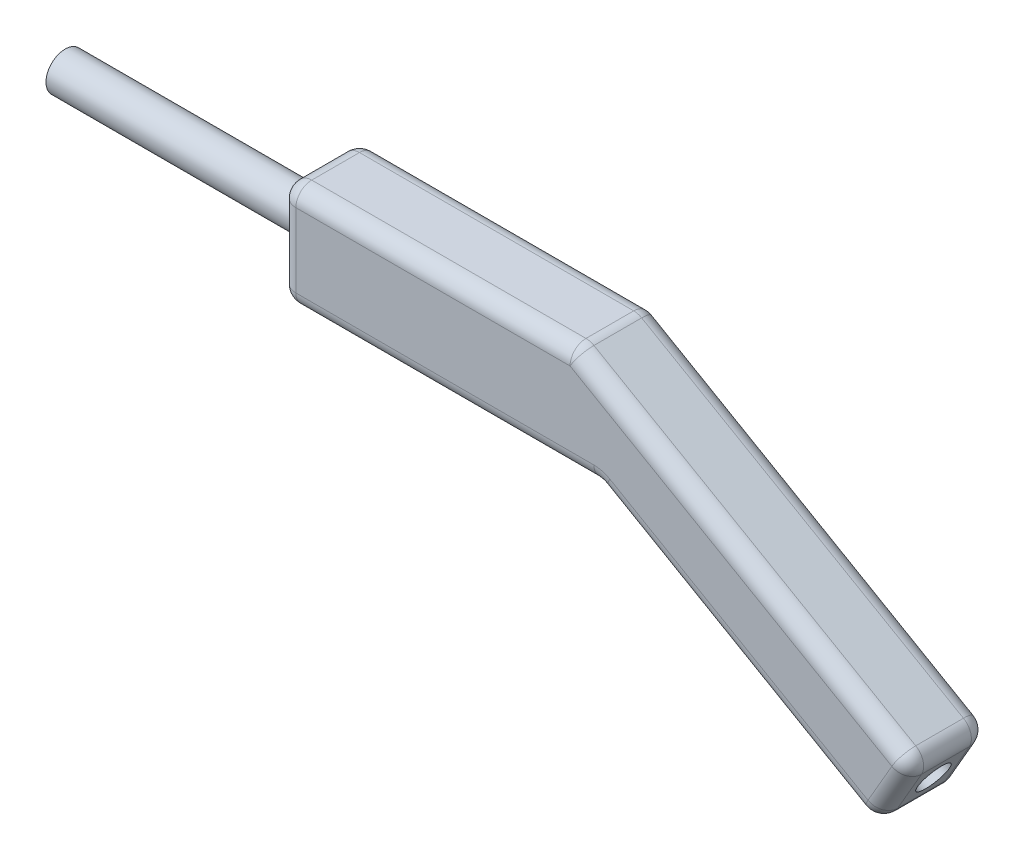
ISO-10303-21;
HEADER;
FILE_DESCRIPTION(('STEP AP214'),'2;1');
FILE_NAME('part.step','',(''),(''),'','','');
FILE_SCHEMA(('AUTOMOTIVE_DESIGN { 1 0 10303 214 1 1 1 1 }'));
ENDSEC;
DATA;
#1=APPLICATION_CONTEXT('core data for automotive mechanical design processes');
#2=APPLICATION_PROTOCOL_DEFINITION('international standard','automotive_design',2000,#1);
#3=PRODUCT_CONTEXT('',#1,'mechanical');
#4=PRODUCT('Part','Part','',(#3));
#5=PRODUCT_RELATED_PRODUCT_CATEGORY('part','',(#4));
#6=PRODUCT_DEFINITION_FORMATION('','',#4);
#7=PRODUCT_DEFINITION_CONTEXT('part definition',#1,'design');
#8=PRODUCT_DEFINITION('design','',#6,#7);
#9=PRODUCT_DEFINITION_SHAPE('','',#8);
#10=(LENGTH_UNIT() NAMED_UNIT(*) SI_UNIT(.MILLI.,.METRE.));
#11=(NAMED_UNIT(*) PLANE_ANGLE_UNIT() SI_UNIT($,.RADIAN.));
#12=(NAMED_UNIT(*) SI_UNIT($,.STERADIAN.) SOLID_ANGLE_UNIT());
#13=UNCERTAINTY_MEASURE_WITH_UNIT(LENGTH_MEASURE(1.E-05),#10,'distance_accuracy_value','');
#14=(GEOMETRIC_REPRESENTATION_CONTEXT(3) GLOBAL_UNCERTAINTY_ASSIGNED_CONTEXT((#13)) GLOBAL_UNIT_ASSIGNED_CONTEXT((#10,
#11,#12)) REPRESENTATION_CONTEXT('',''));
#15=CARTESIAN_POINT('',(0.,0.,0.));
#16=DIRECTION('',(0.,0.,1.));
#17=DIRECTION('',(1.,0.,0.));
#18=AXIS2_PLACEMENT_3D('',#15,#16,#17);
#19=CARTESIAN_POINT('',(2.06544742485837,-1.78301475115433,2.5));
#20=DIRECTION('',(0.499999999999998,0.86602540378444,0.));
#21=DIRECTION('',(-0.86602540378444,0.499999999999998,0.));
#22=AXIS2_PLACEMENT_3D('',#19,#20,#21);
#23=PLANE('',#22);
#24=DIRECTION('',(0.,0.,-1.));
#25=VECTOR('',#24,1.);
#26=CARTESIAN_POINT('',(2.18147282864281,-1.85000204926211,0.));
#27=LINE('',#26,#25);
#28=CARTESIAN_POINT('',(2.18147282864281,-1.85000204926211,2.));
#29=VERTEX_POINT('',#28);
#30=CARTESIAN_POINT('',(2.18147282864281,-1.85000204926211,0.5));
#31=VERTEX_POINT('',#30);
#32=EDGE_CURVE('E326',#29,#31,#27,.T.);
#33=ORIENTED_EDGE('',*,*,#32,.T.);
#34=DIRECTION('',(0.86602540378444,-0.499999999999998,0.));
#35=VECTOR('',#34,1.);
#36=CARTESIAN_POINT('',(2.06544742485837,-1.78301475115433,0.5));
#37=LINE('',#36,#35);
#38=CARTESIAN_POINT('',(10.2926887608106,-6.53301475115431,0.5));
#39=VERTEX_POINT('',#38);
#40=EDGE_CURVE('E329',#31,#39,#37,.T.);
#41=ORIENTED_EDGE('',*,*,#40,.T.);
#42=DIRECTION('',(0.,0.,-1.));
#43=VECTOR('',#42,1.);
#44=CARTESIAN_POINT('',(10.2926887608106,-6.53301475115431,2.5));
#45=LINE('',#44,#43);
#46=CARTESIAN_POINT('',(10.2926887608106,-6.53301475115431,2.));
#47=VERTEX_POINT('',#46);
#48=EDGE_CURVE('E324',#39,#47,#45,.F.);
#49=ORIENTED_EDGE('',*,*,#48,.T.);
#50=DIRECTION('',(0.86602540378444,-0.499999999999998,0.));
#51=VECTOR('',#50,1.);
#52=CARTESIAN_POINT('',(2.06544742485837,-1.78301475115433,2.));
#53=LINE('',#52,#51);
#54=EDGE_CURVE('E322',#47,#29,#53,.F.);
#55=ORIENTED_EDGE('',*,*,#54,.T.);
#56=EDGE_LOOP('',(#33,#41,#49,#55));
#57=FACE_BOUND('',#56,.T.);
#58=ADVANCED_FACE('F37',(#57),#23,.F.);
#59=CARTESIAN_POINT('',(10.7257014627028,-6.78301475115431,2.5));
#60=DIRECTION('',(-0.866025403784439,0.5,0.));
#61=DIRECTION('',(-0.5,-0.866025403784439,0.));
#62=AXIS2_PLACEMENT_3D('',#59,#60,#61);
#63=PLANE('',#62);
#64=DIRECTION('',(0.,0.,-1.));
#65=VECTOR('',#64,1.);
#66=CARTESIAN_POINT('',(10.9757014627028,-6.35000204926209,2.5));
#67=LINE('',#66,#65);
#68=CARTESIAN_POINT('',(10.9757014627028,-6.35000204926209,2.));
#69=VERTEX_POINT('',#68);
#70=CARTESIAN_POINT('',(10.9757014627028,-6.35000204926209,0.5));
#71=VERTEX_POINT('',#70);
#72=EDGE_CURVE('E182',#69,#71,#67,.T.);
#73=ORIENTED_EDGE('',*,*,#72,.T.);
#74=DIRECTION('',(0.5,0.866025403784439,0.));
#75=VECTOR('',#74,1.);
#76=CARTESIAN_POINT('',(10.7257014627028,-6.78301475115431,0.5));
#77=LINE('',#76,#75);
#78=CARTESIAN_POINT('',(11.7257014627028,-5.05096394358546,0.5));
#79=VERTEX_POINT('',#78);
#80=EDGE_CURVE('E178',#71,#79,#77,.T.);
#81=ORIENTED_EDGE('',*,*,#80,.T.);
#82=DIRECTION('',(0.,0.,-1.));
#83=VECTOR('',#82,1.);
#84=CARTESIAN_POINT('',(11.7257014627028,-5.05096394358546,2.5));
#85=LINE('',#84,#83);
#86=CARTESIAN_POINT('',(11.7257014627028,-5.05096394358546,2.));
#87=VERTEX_POINT('',#86);
#88=EDGE_CURVE('E171',#79,#87,#85,.F.);
#89=ORIENTED_EDGE('',*,*,#88,.T.);
#90=DIRECTION('',(0.5,0.866025403784439,0.));
#91=VECTOR('',#90,1.);
#92=CARTESIAN_POINT('',(10.7257014627028,-6.78301475115431,2.));
#93=LINE('',#92,#91);
#94=EDGE_CURVE('E175',#87,#69,#93,.F.);
#95=ORIENTED_EDGE('',*,*,#94,.T.);
#96=EDGE_LOOP('',(#73,#81,#89,#95));
#97=FACE_BOUND('',#96,.T.);
#98=CARTESIAN_POINT('',(11.3507014627028,-5.70048299642376,1.25));
#99=DIRECTION('',(0.866025403784439,-0.5,0.));
#100=DIRECTION('',(0.5,0.866025403784439,0.));
#101=AXIS2_PLACEMENT_3D('',#98,#99,#100);
#102=CIRCLE('',#101,0.5);
#103=CARTESIAN_POINT('',(11.6007014627028,-5.26747029453154,1.25));
#104=VERTEX_POINT('',#103);
#105=EDGE_CURVE('E292',#104,#104,#102,.T.);
#106=ORIENTED_EDGE('',*,*,#105,.F.);
#107=EDGE_LOOP('',(#106));
#108=FACE_BOUND('',#107,.T.);
#109=ADVANCED_FACE('F173',(#97,#108),#63,.F.);
#110=CARTESIAN_POINT('',(1.31544742485839,1.53674929668601,2.5));
#111=DIRECTION('',(-0.5,-0.866025403784439,0.));
#112=DIRECTION('',(0.866025403784439,-0.5,0.));
#113=AXIS2_PLACEMENT_3D('',#110,#111,#112);
#114=PLANE('',#113);
#115=DIRECTION('',(-0.866025403784439,0.5,0.));
#116=VECTOR('',#115,1.);
#117=CARTESIAN_POINT('',(11.9757014627028,-4.61795124169324,2.));
#118=LINE('',#117,#116);
#119=CARTESIAN_POINT('',(1.43147282864283,1.46976199857822,2.));
#120=VERTEX_POINT('',#119);
#121=CARTESIAN_POINT('',(11.5426887608105,-4.36795124169324,2.));
#122=VERTEX_POINT('',#121);
#123=EDGE_CURVE('E342',#120,#122,#118,.F.);
#124=ORIENTED_EDGE('',*,*,#123,.T.);
#125=DIRECTION('',(0.,0.,-1.));
#126=VECTOR('',#125,1.);
#127=CARTESIAN_POINT('',(11.5426887608105,-4.36795124169324,2.5));
#128=LINE('',#127,#126);
#129=CARTESIAN_POINT('',(11.5426887608105,-4.36795124169324,0.5));
#130=VERTEX_POINT('',#129);
#131=EDGE_CURVE('E206',#122,#130,#128,.T.);
#132=ORIENTED_EDGE('',*,*,#131,.T.);
#133=DIRECTION('',(-0.866025403784439,0.5,0.));
#134=VECTOR('',#133,1.);
#135=CARTESIAN_POINT('',(1.31544742485839,1.53674929668601,0.5));
#136=LINE('',#135,#134);
#137=CARTESIAN_POINT('',(1.43147282864283,1.46976199857822,0.5));
#138=VERTEX_POINT('',#137);
#139=EDGE_CURVE('E344',#130,#138,#136,.T.);
#140=ORIENTED_EDGE('',*,*,#139,.T.);
#141=DIRECTION('',(0.,0.,-1.));
#142=VECTOR('',#141,1.);
#143=CARTESIAN_POINT('',(1.43147282864283,1.46976199857822,2.5));
#144=LINE('',#143,#142);
#145=EDGE_CURVE('E340',#138,#120,#144,.F.);
#146=ORIENTED_EDGE('',*,*,#145,.T.);
#147=EDGE_LOOP('',(#124,#132,#140,#146));
#148=FACE_BOUND('',#147,.T.);
#149=ADVANCED_FACE('F414',(#148),#114,.F.);
#150=CARTESIAN_POINT('',(-7.93455257514163,1.53674929668601,2.5));
#151=DIRECTION('',(0.,-1.,0.));
#152=DIRECTION('',(0.,0.,-1.));
#153=AXIS2_PLACEMENT_3D('',#150,#151,#152);
#154=PLANE('',#153);
#155=DIRECTION('',(-1.,0.,0.));
#156=VECTOR('',#155,1.);
#157=CARTESIAN_POINT('',(1.31544742485839,1.53674929668601,2.));
#158=LINE('',#157,#156);
#159=CARTESIAN_POINT('',(-7.43455257514163,1.53674929668601,2.));
#160=VERTEX_POINT('',#159);
#161=CARTESIAN_POINT('',(1.18147282864283,1.53674929668601,2.));
#162=VERTEX_POINT('',#161);
#163=EDGE_CURVE('E367',#160,#162,#158,.F.);
#164=ORIENTED_EDGE('',*,*,#163,.T.);
#165=DIRECTION('',(0.,0.,-1.));
#166=VECTOR('',#165,1.);
#167=CARTESIAN_POINT('',(1.18147282864283,1.53674929668601,2.5));
#168=LINE('',#167,#166);
#169=CARTESIAN_POINT('',(1.18147282864283,1.53674929668601,0.5));
#170=VERTEX_POINT('',#169);
#171=EDGE_CURVE('E369',#162,#170,#168,.T.);
#172=ORIENTED_EDGE('',*,*,#171,.T.);
#173=DIRECTION('',(-1.,0.,0.));
#174=VECTOR('',#173,1.);
#175=CARTESIAN_POINT('',(-7.93455257514163,1.53674929668601,0.5));
#176=LINE('',#175,#174);
#177=CARTESIAN_POINT('',(-7.43455257514163,1.53674929668601,0.5));
#178=VERTEX_POINT('',#177);
#179=EDGE_CURVE('E365',#170,#178,#176,.T.);
#180=ORIENTED_EDGE('',*,*,#179,.T.);
#181=DIRECTION('',(0.,0.,-1.));
#182=VECTOR('',#181,1.);
#183=CARTESIAN_POINT('',(-7.43455257514163,1.53674929668601,2.5));
#184=LINE('',#183,#182);
#185=EDGE_CURVE('E363',#178,#160,#184,.F.);
#186=ORIENTED_EDGE('',*,*,#185,.T.);
#187=EDGE_LOOP('',(#164,#172,#180,#186));
#188=FACE_BOUND('',#187,.T.);
#189=ADVANCED_FACE('F531',(#188),#154,.F.);
#190=CARTESIAN_POINT('',(-7.93455257514163,1.53674929668601,2.5));
#191=DIRECTION('',(1.,0.,0.));
#192=DIRECTION('',(0.,0.,-1.));
#193=AXIS2_PLACEMENT_3D('',#190,#191,#192);
#194=PLANE('',#193);
#195=DIRECTION('',(0.,0.,-1.));
#196=VECTOR('',#195,1.);
#197=CARTESIAN_POINT('',(-7.93455257514163,1.03674929668601,2.5));
#198=LINE('',#197,#196);
#199=CARTESIAN_POINT('',(-7.93455257514163,1.03674929668601,2.));
#200=VERTEX_POINT('',#199);
#201=CARTESIAN_POINT('',(-7.93455257514163,1.03674929668601,0.5));
#202=VERTEX_POINT('',#201);
#203=EDGE_CURVE('E372',#200,#202,#198,.T.);
#204=ORIENTED_EDGE('',*,*,#203,.T.);
#205=DIRECTION('',(0.,-1.,0.));
#206=VECTOR('',#205,1.);
#207=CARTESIAN_POINT('',(-7.93455257514163,1.53674929668601,0.5));
#208=LINE('',#207,#206);
#209=CARTESIAN_POINT('',(-7.93455257514163,-1.28301475115433,0.5));
#210=VERTEX_POINT('',#209);
#211=EDGE_CURVE('E11',#202,#210,#208,.T.);
#212=ORIENTED_EDGE('',*,*,#211,.T.);
#213=DIRECTION('',(0.,0.,-1.));
#214=VECTOR('',#213,1.);
#215=CARTESIAN_POINT('',(-7.93455257514163,-1.28301475115433,2.5));
#216=LINE('',#215,#214);
#217=CARTESIAN_POINT('',(-7.93455257514163,-1.28301475115433,2.));
#218=VERTEX_POINT('',#217);
#219=EDGE_CURVE('E46',#210,#218,#216,.F.);
#220=ORIENTED_EDGE('',*,*,#219,.T.);
#221=DIRECTION('',(0.,-1.,0.));
#222=VECTOR('',#221,1.);
#223=CARTESIAN_POINT('',(-7.93455257514163,1.53674929668601,2.));
#224=LINE('',#223,#222);
#225=EDGE_CURVE('E374',#218,#200,#224,.F.);
#226=ORIENTED_EDGE('',*,*,#225,.T.);
#227=EDGE_LOOP('',(#204,#212,#220,#226));
#228=FACE_BOUND('',#227,.T.);
#229=CARTESIAN_POINT('',(-7.93455257514163,-0.123132727234164,1.25));
#230=DIRECTION('',(-1.,0.,0.));
#231=DIRECTION('',(0.,0.,1.));
#232=AXIS2_PLACEMENT_3D('',#229,#230,#231);
#233=CIRCLE('',#232,0.6);
#234=CARTESIAN_POINT('',(-7.93455257514163,-0.123132727234164,1.85));
#235=VERTEX_POINT('',#234);
#236=EDGE_CURVE('E194',#235,#235,#233,.T.);
#237=ORIENTED_EDGE('',*,*,#236,.F.);
#238=EDGE_LOOP('',(#237));
#239=FACE_BOUND('',#238,.T.);
#240=ADVANCED_FACE('F549',(#228,#239),#194,.F.);
#241=CARTESIAN_POINT('',(-7.93455257514163,-1.78301475115433,2.5));
#242=DIRECTION('',(0.,1.,0.));
#243=DIRECTION('',(-1.,0.,0.));
#244=AXIS2_PLACEMENT_3D('',#241,#242,#243);
#245=PLANE('',#244);
#246=DIRECTION('',(1.,0.,0.));
#247=VECTOR('',#246,1.);
#248=CARTESIAN_POINT('',(-7.93455257514163,-1.78301475115433,0.5));
#249=LINE('',#248,#247);
#250=CARTESIAN_POINT('',(-7.43455257514163,-1.78301475115433,0.5));
#251=VERTEX_POINT('',#250);
#252=CARTESIAN_POINT('',(1.93147282864281,-1.78301475115433,0.5));
#253=VERTEX_POINT('',#252);
#254=EDGE_CURVE('E333',#251,#253,#249,.T.);
#255=ORIENTED_EDGE('',*,*,#254,.T.);
#256=DIRECTION('',(0.,0.,-1.));
#257=VECTOR('',#256,1.);
#258=CARTESIAN_POINT('',(1.93147282864281,-1.78301475115433,2.5));
#259=LINE('',#258,#257);
#260=CARTESIAN_POINT('',(1.93147282864281,-1.78301475115433,2.));
#261=VERTEX_POINT('',#260);
#262=EDGE_CURVE('E337',#253,#261,#259,.F.);
#263=ORIENTED_EDGE('',*,*,#262,.T.);
#264=DIRECTION('',(1.,0.,0.));
#265=VECTOR('',#264,1.);
#266=CARTESIAN_POINT('',(-7.93455257514163,-1.78301475115433,2.));
#267=LINE('',#266,#265);
#268=CARTESIAN_POINT('',(-7.43455257514163,-1.78301475115433,2.));
#269=VERTEX_POINT('',#268);
#270=EDGE_CURVE('E335',#261,#269,#267,.F.);
#271=ORIENTED_EDGE('',*,*,#270,.T.);
#272=DIRECTION('',(0.,0.,-1.));
#273=VECTOR('',#272,1.);
#274=CARTESIAN_POINT('',(-7.43455257514163,-1.78301475115433,2.5));
#275=LINE('',#274,#273);
#276=EDGE_CURVE('E331',#269,#251,#275,.T.);
#277=ORIENTED_EDGE('',*,*,#276,.T.);
#278=EDGE_LOOP('',(#255,#263,#271,#277));
#279=FACE_BOUND('',#278,.T.);
#280=ADVANCED_FACE('F546',(#279),#245,.F.);
#281=CARTESIAN_POINT('',(0.,0.,2.5));
#282=DIRECTION('',(0.,0.,1.));
#283=DIRECTION('',(1.,0.,0.));
#284=AXIS2_PLACEMENT_3D('',#281,#282,#283);
#285=PLANE('',#284);
#286=CARTESIAN_POINT('',(1.93147282864281,-2.28301475115433,2.5));
#287=DIRECTION('',(0.,0.,1.));
#288=DIRECTION('',(1.,0.,0.));
#289=AXIS2_PLACEMENT_3D('',#286,#287,#288);
#290=CIRCLE('',#289,1.);
#291=CARTESIAN_POINT('',(2.43147282864281,-1.41698934736989,2.5));
#292=VERTEX_POINT('',#291);
#293=CARTESIAN_POINT('',(1.93147282864281,-1.28301475115433,2.5));
#294=VERTEX_POINT('',#293);
#295=EDGE_CURVE('E358',#292,#294,#290,.T.);
#296=ORIENTED_EDGE('',*,*,#295,.F.);
#297=DIRECTION('',(0.86602540378444,-0.499999999999998,0.));
#298=VECTOR('',#297,1.);
#299=CARTESIAN_POINT('',(10.9757014627028,-6.35000204926209,2.5));
#300=LINE('',#299,#298);
#301=CARTESIAN_POINT('',(10.5426887608106,-6.10000204926209,2.5));
#302=VERTEX_POINT('',#301);
#303=EDGE_CURVE('E361',#292,#302,#300,.T.);
#304=ORIENTED_EDGE('',*,*,#303,.T.);
#305=DIRECTION('',(0.5,0.866025403784439,0.));
#306=VECTOR('',#305,1.);
#307=CARTESIAN_POINT('',(11.5426887608105,-4.36795124169324,2.5));
#308=LINE('',#307,#306);
#309=CARTESIAN_POINT('',(11.2926887608105,-4.80096394358546,2.5));
#310=VERTEX_POINT('',#309);
#311=EDGE_CURVE('E355',#302,#310,#308,.T.);
#312=ORIENTED_EDGE('',*,*,#311,.T.);
#313=DIRECTION('',(-0.866025403784439,0.5,0.));
#314=VECTOR('',#313,1.);
#315=CARTESIAN_POINT('',(1.06544742485839,1.10373659479379,2.5));
#316=LINE('',#315,#314);
#317=CARTESIAN_POINT('',(1.18147282864283,1.03674929668601,2.5));
#318=VERTEX_POINT('',#317);
#319=EDGE_CURVE('E353',#310,#318,#316,.T.);
#320=ORIENTED_EDGE('',*,*,#319,.T.);
#321=DIRECTION('',(-1.,0.,0.));
#322=VECTOR('',#321,1.);
#323=CARTESIAN_POINT('',(-7.93455257514163,1.03674929668601,2.5));
#324=LINE('',#323,#322);
#325=CARTESIAN_POINT('',(-7.43455257514163,1.03674929668601,2.5));
#326=VERTEX_POINT('',#325);
#327=EDGE_CURVE('E349',#318,#326,#324,.T.);
#328=ORIENTED_EDGE('',*,*,#327,.T.);
#329=DIRECTION('',(0.,-1.,0.));
#330=VECTOR('',#329,1.);
#331=CARTESIAN_POINT('',(-7.43455257514163,-1.78301475115433,2.5));
#332=LINE('',#331,#330);
#333=CARTESIAN_POINT('',(-7.43455257514163,-1.28301475115433,2.5));
#334=VERTEX_POINT('',#333);
#335=EDGE_CURVE('E347',#326,#334,#332,.T.);
#336=ORIENTED_EDGE('',*,*,#335,.T.);
#337=DIRECTION('',(1.,0.,0.));
#338=VECTOR('',#337,1.);
#339=CARTESIAN_POINT('',(2.06544742485837,-1.28301475115433,2.5));
#340=LINE('',#339,#338);
#341=EDGE_CURVE('E351',#334,#294,#340,.T.);
#342=ORIENTED_EDGE('',*,*,#341,.T.);
#343=EDGE_LOOP('',(#296,#304,#312,#320,#328,#336,#342));
#344=FACE_BOUND('',#343,.T.);
#345=ADVANCED_FACE('F421',(#344),#285,.T.);
#346=CARTESIAN_POINT('',(0.,0.,0.));
#347=DIRECTION('',(0.,0.,1.));
#348=DIRECTION('',(1.,0.,0.));
#349=AXIS2_PLACEMENT_3D('',#346,#347,#348);
#350=PLANE('',#349);
#351=DIRECTION('',(-0.866025403784439,0.5,0.));
#352=VECTOR('',#351,1.);
#353=CARTESIAN_POINT('',(0.744293821303572,1.28915471425738,0.));
#354=LINE('',#353,#352);
#355=CARTESIAN_POINT('',(1.18147282864283,1.03674929668601,0.));
#356=VERTEX_POINT('',#355);
#357=CARTESIAN_POINT('',(11.2926887608105,-4.80096394358546,0.));
#358=VERTEX_POINT('',#357);
#359=EDGE_CURVE('E312',#356,#358,#354,.F.);
#360=ORIENTED_EDGE('',*,*,#359,.T.);
#361=DIRECTION('',(0.5,0.866025403784439,0.));
#362=VECTOR('',#361,1.);
#363=CARTESIAN_POINT('',(10.548394939507,-6.09011865784283,0.));
#364=LINE('',#363,#362);
#365=CARTESIAN_POINT('',(10.5426887608106,-6.10000204926209,0.));
#366=VERTEX_POINT('',#365);
#367=EDGE_CURVE('E319',#358,#366,#364,.F.);
#368=ORIENTED_EDGE('',*,*,#367,.T.);
#369=DIRECTION('',(0.86602540378444,-0.499999999999998,0.));
#370=VECTOR('',#369,1.);
#371=CARTESIAN_POINT('',(-0.0057061786964315,-0.00988339141928657,0.));
#372=LINE('',#371,#370);
#373=CARTESIAN_POINT('',(2.43147282864281,-1.41698934736989,0.));
#374=VERTEX_POINT('',#373);
#375=EDGE_CURVE('E317',#366,#374,#372,.F.);
#376=ORIENTED_EDGE('',*,*,#375,.T.);
#377=CARTESIAN_POINT('',(1.93147282864281,-2.28301475115433,0.));
#378=DIRECTION('',(0.,0.,1.));
#379=DIRECTION('',(1.,0.,0.));
#380=AXIS2_PLACEMENT_3D('',#377,#378,#379);
#381=CIRCLE('',#380,1.);
#382=CARTESIAN_POINT('',(1.93147282864281,-1.28301475115433,0.));
#383=VERTEX_POINT('',#382);
#384=EDGE_CURVE('E314',#383,#374,#381,.F.);
#385=ORIENTED_EDGE('',*,*,#384,.F.);
#386=DIRECTION('',(1.,0.,0.));
#387=VECTOR('',#386,1.);
#388=CARTESIAN_POINT('',(0.,-1.28301475115433,0.));
#389=LINE('',#388,#387);
#390=CARTESIAN_POINT('',(-7.43455257514163,-1.28301475115433,0.));
#391=VERTEX_POINT('',#390);
#392=EDGE_CURVE('E310',#383,#391,#389,.F.);
#393=ORIENTED_EDGE('',*,*,#392,.T.);
#394=DIRECTION('',(0.,-1.,0.));
#395=VECTOR('',#394,1.);
#396=CARTESIAN_POINT('',(-7.43455257514163,0.,0.));
#397=LINE('',#396,#395);
#398=CARTESIAN_POINT('',(-7.43455257514163,1.03674929668601,0.));
#399=VERTEX_POINT('',#398);
#400=EDGE_CURVE('E306',#391,#399,#397,.F.);
#401=ORIENTED_EDGE('',*,*,#400,.T.);
#402=DIRECTION('',(-1.,0.,0.));
#403=VECTOR('',#402,1.);
#404=CARTESIAN_POINT('',(0.,1.03674929668601,0.));
#405=LINE('',#404,#403);
#406=EDGE_CURVE('E308',#399,#356,#405,.F.);
#407=ORIENTED_EDGE('',*,*,#406,.T.);
#408=EDGE_LOOP('',(#360,#368,#376,#385,#393,#401,#407));
#409=FACE_BOUND('',#408,.T.);
#410=ADVANCED_FACE('F400',(#409),#350,.F.);
#411=CARTESIAN_POINT('',(4.42249823242727,-1.70048299642376,1.25));
#412=DIRECTION('',(0.866025403784439,-0.5,0.));
#413=DIRECTION('',(0.5,0.866025403784439,0.));
#414=AXIS2_PLACEMENT_3D('',#411,#412,#413);
#415=CYLINDRICAL_SURFACE('',#414,0.5);
#416=CARTESIAN_POINT('',(4.42249823242727,-1.70048299642376,1.25));
#417=DIRECTION('',(0.866025403784439,-0.5,0.));
#418=DIRECTION('',(0.5,0.866025403784439,0.));
#419=AXIS2_PLACEMENT_3D('',#416,#417,#418);
#420=CIRCLE('',#419,0.5);
#421=CARTESIAN_POINT('',(4.67249823242727,-1.26747029453154,1.25));
#422=VERTEX_POINT('',#421);
#423=EDGE_CURVE('E297',#422,#422,#420,.T.);
#424=ORIENTED_EDGE('',*,*,#423,.F.);
#425=EDGE_LOOP('',(#424));
#426=FACE_BOUND('',#425,.T.);
#427=ORIENTED_EDGE('',*,*,#105,.T.);
#428=EDGE_LOOP('',(#427));
#429=FACE_BOUND('',#428,.T.);
#430=ADVANCED_FACE('F766',(#426,#429),#415,.F.);
#431=CARTESIAN_POINT('',(4.42249823242727,-1.70048299642376,1.25));
#432=DIRECTION('',(0.866025403784439,-0.5,0.));
#433=DIRECTION('',(0.5,0.866025403784439,0.));
#434=AXIS2_PLACEMENT_3D('',#431,#432,#433);
#435=PLANE('',#434);
#436=ORIENTED_EDGE('',*,*,#423,.T.);
#437=EDGE_LOOP('',(#436));
#438=FACE_BOUND('',#437,.T.);
#439=ADVANCED_FACE('F757',(#438),#435,.T.);
#440=CARTESIAN_POINT('',(-15.9345525751416,-0.123132727234164,1.25));
#441=DIRECTION('',(1.,0.,0.));
#442=DIRECTION('',(0.,0.,-1.));
#443=AXIS2_PLACEMENT_3D('',#440,#441,#442);
#444=CYLINDRICAL_SURFACE('',#443,0.6);
#445=CARTESIAN_POINT('',(-15.9345525751416,-0.123132727234164,1.25));
#446=DIRECTION('',(-1.,0.,0.));
#447=DIRECTION('',(0.,0.,1.));
#448=AXIS2_PLACEMENT_3D('',#445,#446,#447);
#449=CIRCLE('',#448,0.6);
#450=CARTESIAN_POINT('',(-15.9345525751416,-0.123132727234164,1.85));
#451=VERTEX_POINT('',#450);
#452=EDGE_CURVE('E286',#451,#451,#449,.T.);
#453=ORIENTED_EDGE('',*,*,#452,.F.);
#454=EDGE_LOOP('',(#453));
#455=FACE_BOUND('',#454,.T.);
#456=ORIENTED_EDGE('',*,*,#236,.T.);
#457=EDGE_LOOP('',(#456));
#458=FACE_BOUND('',#457,.T.);
#459=ADVANCED_FACE('F749',(#455,#458),#444,.T.);
#460=CARTESIAN_POINT('',(-15.9345525751416,-0.123132727234164,1.25));
#461=DIRECTION('',(-1.,0.,0.));
#462=DIRECTION('',(0.,0.,1.));
#463=AXIS2_PLACEMENT_3D('',#460,#461,#462);
#464=PLANE('',#463);
#465=ORIENTED_EDGE('',*,*,#452,.T.);
#466=EDGE_LOOP('',(#465));
#467=FACE_BOUND('',#466,.T.);
#468=ADVANCED_FACE('F741',(#467),#464,.T.);
#469=CARTESIAN_POINT('',(-7.43455257514163,0.,2.));
#470=DIRECTION('',(0.,1.,0.));
#471=DIRECTION('',(0.,0.,1.));
#472=AXIS2_PLACEMENT_3D('',#469,#470,#471);
#473=CYLINDRICAL_SURFACE('',#472,0.5);
#474=CARTESIAN_POINT('',(-7.43455257514163,-1.28301475115433,2.));
#475=DIRECTION('',(0.,-1.,0.));
#476=DIRECTION('',(0.,0.,-1.));
#477=AXIS2_PLACEMENT_3D('',#474,#475,#476);
#478=CIRCLE('',#477,0.5);
#479=EDGE_CURVE('E41',#334,#218,#478,.T.);
#480=ORIENTED_EDGE('',*,*,#479,.F.);
#481=ORIENTED_EDGE('',*,*,#335,.F.);
#482=CARTESIAN_POINT('',(-7.43455257514163,1.03674929668601,2.));
#483=DIRECTION('',(0.,1.,0.));
#484=DIRECTION('',(0.,0.,1.));
#485=AXIS2_PLACEMENT_3D('',#482,#483,#484);
#486=CIRCLE('',#485,0.5);
#487=EDGE_CURVE('E279',#200,#326,#486,.T.);
#488=ORIENTED_EDGE('',*,*,#487,.F.);
#489=ORIENTED_EDGE('',*,*,#225,.F.);
#490=EDGE_LOOP('',(#480,#481,#488,#489));
#491=FACE_BOUND('',#490,.T.);
#492=ADVANCED_FACE('F39',(#491),#473,.T.);
#493=CARTESIAN_POINT('',(-7.43455257514163,-1.28301475115433,2.));
#494=DIRECTION('',(-1.,0.,0.));
#495=DIRECTION('',(0.,0.,1.));
#496=AXIS2_PLACEMENT_3D('',#493,#494,#495);
#497=SPHERICAL_SURFACE('',#496,0.5);
#498=CARTESIAN_POINT('',(-7.43455257514163,-1.28301475115433,2.));
#499=DIRECTION('',(-1.,0.,0.));
#500=DIRECTION('',(0.,0.,1.));
#501=AXIS2_PLACEMENT_3D('',#498,#499,#500);
#502=CIRCLE('',#501,0.5);
#503=EDGE_CURVE('E274',#334,#269,#502,.F.);
#504=ORIENTED_EDGE('',*,*,#503,.F.);
#505=ORIENTED_EDGE('',*,*,#479,.T.);
#506=CARTESIAN_POINT('',(-7.43455257514163,-1.28301475115433,2.));
#507=DIRECTION('',(0.,0.,1.));
#508=DIRECTION('',(1.,0.,0.));
#509=AXIS2_PLACEMENT_3D('',#506,#507,#508);
#510=CIRCLE('',#509,0.5);
#511=EDGE_CURVE('E277',#269,#218,#510,.F.);
#512=ORIENTED_EDGE('',*,*,#511,.F.);
#513=EDGE_LOOP('',(#504,#505,#512));
#514=FACE_BOUND('',#513,.T.);
#515=ADVANCED_FACE('F539',(#514),#497,.T.);
#516=CARTESIAN_POINT('',(-7.43455257514163,1.03674929668601,2.));
#517=DIRECTION('',(0.,0.,1.));
#518=DIRECTION('',(1.,0.,0.));
#519=AXIS2_PLACEMENT_3D('',#516,#517,#518);
#520=SPHERICAL_SURFACE('',#519,0.5);
#521=CARTESIAN_POINT('',(-7.43455257514163,1.03674929668601,2.));
#522=DIRECTION('',(0.,0.,1.));
#523=DIRECTION('',(1.,0.,0.));
#524=AXIS2_PLACEMENT_3D('',#521,#522,#523);
#525=CIRCLE('',#524,0.5);
#526=EDGE_CURVE('E268',#200,#160,#525,.F.);
#527=ORIENTED_EDGE('',*,*,#526,.F.);
#528=ORIENTED_EDGE('',*,*,#487,.T.);
#529=CARTESIAN_POINT('',(-7.43455257514163,1.03674929668601,2.));
#530=DIRECTION('',(-1.,0.,0.));
#531=DIRECTION('',(0.,0.,1.));
#532=AXIS2_PLACEMENT_3D('',#529,#530,#531);
#533=CIRCLE('',#532,0.5);
#534=EDGE_CURVE('E271',#160,#326,#533,.F.);
#535=ORIENTED_EDGE('',*,*,#534,.F.);
#536=EDGE_LOOP('',(#527,#528,#535));
#537=FACE_BOUND('',#536,.T.);
#538=ADVANCED_FACE('F556',(#537),#520,.T.);
#539=CARTESIAN_POINT('',(-7.43455257514163,-1.28301475115433,2.5));
#540=DIRECTION('',(0.,0.,-1.));
#541=DIRECTION('',(-1.,0.,0.));
#542=AXIS2_PLACEMENT_3D('',#539,#540,#541);
#543=CYLINDRICAL_SURFACE('',#542,0.5);
#544=ORIENTED_EDGE('',*,*,#511,.T.);
#545=ORIENTED_EDGE('',*,*,#219,.F.);
#546=CARTESIAN_POINT('',(-7.43455257514163,-1.28301475115433,0.5));
#547=DIRECTION('',(0.,0.,-1.));
#548=DIRECTION('',(-1.,0.,0.));
#549=AXIS2_PLACEMENT_3D('',#546,#547,#548);
#550=CIRCLE('',#549,0.5);
#551=EDGE_CURVE('E54',#251,#210,#550,.T.);
#552=ORIENTED_EDGE('',*,*,#551,.F.);
#553=ORIENTED_EDGE('',*,*,#276,.F.);
#554=EDGE_LOOP('',(#544,#545,#552,#553));
#555=FACE_BOUND('',#554,.T.);
#556=ADVANCED_FACE('F548',(#555),#543,.T.);
#557=CARTESIAN_POINT('',(0.,-1.28301475115433,2.));
#558=DIRECTION('',(-1.,0.,0.));
#559=DIRECTION('',(0.,-1.,0.));
#560=AXIS2_PLACEMENT_3D('',#557,#558,#559);
#561=CYLINDRICAL_SURFACE('',#560,0.5);
#562=ORIENTED_EDGE('',*,*,#503,.T.);
#563=ORIENTED_EDGE('',*,*,#270,.F.);
#564=CARTESIAN_POINT('',(1.93147282864281,-1.28301475115433,2.));
#565=DIRECTION('',(1.,0.,0.));
#566=DIRECTION('',(0.,0.,-1.));
#567=AXIS2_PLACEMENT_3D('',#564,#565,#566);
#568=CIRCLE('',#567,0.5);
#569=EDGE_CURVE('E262',#294,#261,#568,.T.);
#570=ORIENTED_EDGE('',*,*,#569,.F.);
#571=ORIENTED_EDGE('',*,*,#341,.F.);
#572=EDGE_LOOP('',(#562,#563,#570,#571));
#573=FACE_BOUND('',#572,.T.);
#574=ADVANCED_FACE('F544',(#573),#561,.T.);
#575=CARTESIAN_POINT('',(0.,1.03674929668601,2.));
#576=DIRECTION('',(1.,0.,0.));
#577=DIRECTION('',(0.,0.,-1.));
#578=AXIS2_PLACEMENT_3D('',#575,#576,#577);
#579=CYLINDRICAL_SURFACE('',#578,0.5);
#580=ORIENTED_EDGE('',*,*,#534,.T.);
#581=ORIENTED_EDGE('',*,*,#327,.F.);
#582=CARTESIAN_POINT('',(1.18147282864283,1.03674929668601,2.));
#583=DIRECTION('',(1.,0.,0.));
#584=DIRECTION('',(0.,0.,-1.));
#585=AXIS2_PLACEMENT_3D('',#582,#583,#584);
#586=CIRCLE('',#585,0.5);
#587=EDGE_CURVE('E259',#162,#318,#586,.T.);
#588=ORIENTED_EDGE('',*,*,#587,.F.);
#589=ORIENTED_EDGE('',*,*,#163,.F.);
#590=EDGE_LOOP('',(#580,#581,#588,#589));
#591=FACE_BOUND('',#590,.T.);
#592=ADVANCED_FACE('F535',(#591),#579,.T.);
#593=CARTESIAN_POINT('',(-7.43455257514163,1.03674929668601,2.5));
#594=DIRECTION('',(0.,0.,-1.));
#595=DIRECTION('',(-1.,0.,0.));
#596=AXIS2_PLACEMENT_3D('',#593,#594,#595);
#597=CYLINDRICAL_SURFACE('',#596,0.5);
#598=ORIENTED_EDGE('',*,*,#526,.T.);
#599=ORIENTED_EDGE('',*,*,#185,.F.);
#600=CARTESIAN_POINT('',(-7.43455257514163,1.03674929668601,0.5));
#601=DIRECTION('',(0.,0.,-1.));
#602=DIRECTION('',(-1.,0.,0.));
#603=AXIS2_PLACEMENT_3D('',#600,#601,#602);
#604=CIRCLE('',#603,0.5);
#605=EDGE_CURVE('E256',#202,#178,#604,.T.);
#606=ORIENTED_EDGE('',*,*,#605,.F.);
#607=ORIENTED_EDGE('',*,*,#203,.F.);
#608=EDGE_LOOP('',(#598,#599,#606,#607));
#609=FACE_BOUND('',#608,.T.);
#610=ADVANCED_FACE('F465',(#609),#597,.T.);
#611=CARTESIAN_POINT('',(-7.43455257514163,1.53674929668601,0.5));
#612=DIRECTION('',(0.,-1.,0.));
#613=DIRECTION('',(0.,0.,-1.));
#614=AXIS2_PLACEMENT_3D('',#611,#612,#613);
#615=CYLINDRICAL_SURFACE('',#614,0.5);
#616=CARTESIAN_POINT('',(-7.43455257514163,-1.28301475115433,0.5));
#617=DIRECTION('',(0.,-1.,0.));
#618=DIRECTION('',(0.,0.,-1.));
#619=AXIS2_PLACEMENT_3D('',#616,#617,#618);
#620=CIRCLE('',#619,0.5);
#621=EDGE_CURVE('E266',#210,#391,#620,.T.);
#622=ORIENTED_EDGE('',*,*,#621,.F.);
#623=ORIENTED_EDGE('',*,*,#211,.F.);
#624=CARTESIAN_POINT('',(-7.43455257514163,1.03674929668601,0.5));
#625=DIRECTION('',(0.,1.,0.));
#626=DIRECTION('',(0.,0.,1.));
#627=AXIS2_PLACEMENT_3D('',#624,#625,#626);
#628=CIRCLE('',#627,0.5);
#629=EDGE_CURVE('E253',#399,#202,#628,.T.);
#630=ORIENTED_EDGE('',*,*,#629,.F.);
#631=ORIENTED_EDGE('',*,*,#400,.F.);
#632=EDGE_LOOP('',(#622,#623,#630,#631));
#633=FACE_BOUND('',#632,.T.);
#634=ADVANCED_FACE('F451',(#633),#615,.T.);
#635=CARTESIAN_POINT('',(-7.43455257514163,-1.28301475115433,0.5));
#636=DIRECTION('',(-1.,0.,0.));
#637=DIRECTION('',(0.,0.,1.));
#638=AXIS2_PLACEMENT_3D('',#635,#636,#637);
#639=SPHERICAL_SURFACE('',#638,0.5);
#640=ORIENTED_EDGE('',*,*,#551,.T.);
#641=ORIENTED_EDGE('',*,*,#621,.T.);
#642=CARTESIAN_POINT('',(-7.43455257514163,-1.28301475115433,0.5));
#643=DIRECTION('',(-1.,0.,0.));
#644=DIRECTION('',(0.,0.,1.));
#645=AXIS2_PLACEMENT_3D('',#642,#643,#644);
#646=CIRCLE('',#645,0.5);
#647=EDGE_CURVE('E250',#251,#391,#646,.F.);
#648=ORIENTED_EDGE('',*,*,#647,.F.);
#649=EDGE_LOOP('',(#640,#641,#648));
#650=FACE_BOUND('',#649,.T.);
#651=ADVANCED_FACE('F454',(#650),#639,.T.);
#652=CARTESIAN_POINT('',(1.93147282864281,-2.28301475115433,2.));
#653=DIRECTION('',(0.,0.,1.));
#654=DIRECTION('',(1.,0.,0.));
#655=AXIS2_PLACEMENT_3D('',#652,#653,#654);
#656=TOROIDAL_SURFACE('',#655,1.,0.5);
#657=ORIENTED_EDGE('',*,*,#295,.T.);
#658=ORIENTED_EDGE('',*,*,#569,.T.);
#659=CARTESIAN_POINT('',(1.93147282864281,-2.28301475115433,2.));
#660=DIRECTION('',(0.,0.,1.));
#661=DIRECTION('',(1.,0.,0.));
#662=AXIS2_PLACEMENT_3D('',#659,#660,#661);
#663=CIRCLE('',#662,0.5);
#664=EDGE_CURVE('E248',#29,#261,#663,.T.);
#665=ORIENTED_EDGE('',*,*,#664,.F.);
#666=CARTESIAN_POINT('',(2.43147282864281,-1.41698934736989,2.));
#667=DIRECTION('',(-0.86602540378444,0.499999999999998,0.));
#668=DIRECTION('',(-0.499999999999998,-0.86602540378444,0.));
#669=AXIS2_PLACEMENT_3D('',#666,#667,#668);
#670=CIRCLE('',#669,0.5);
#671=EDGE_CURVE('E245',#292,#29,#670,.F.);
#672=ORIENTED_EDGE('',*,*,#671,.F.);
#673=EDGE_LOOP('',(#657,#658,#665,#672));
#674=FACE_BOUND('',#673,.T.);
#675=ADVANCED_FACE('F456',(#674),#656,.T.);
#676=CARTESIAN_POINT('',(1.18147282864283,1.03674929668601,2.));
#677=DIRECTION('',(0.,0.,1.));
#678=DIRECTION('',(1.,0.,0.));
#679=AXIS2_PLACEMENT_3D('',#676,#677,#678);
#680=SPHERICAL_SURFACE('',#679,0.5);
#681=CARTESIAN_POINT('',(1.18147282864283,1.03674929668601,2.));
#682=DIRECTION('',(0.,0.,1.));
#683=DIRECTION('',(1.,0.,0.));
#684=AXIS2_PLACEMENT_3D('',#681,#682,#683);
#685=CIRCLE('',#684,0.5);
#686=EDGE_CURVE('E239',#162,#120,#685,.F.);
#687=ORIENTED_EDGE('',*,*,#686,.F.);
#688=ORIENTED_EDGE('',*,*,#587,.T.);
#689=CARTESIAN_POINT('',(1.18147282864283,1.03674929668601,2.));
#690=DIRECTION('',(-0.866025403784438,0.5,0.));
#691=DIRECTION('',(-0.5,-0.866025403784439,0.));
#692=AXIS2_PLACEMENT_3D('',#689,#690,#691);
#693=CIRCLE('',#692,0.5);
#694=EDGE_CURVE('E242',#120,#318,#693,.F.);
#695=ORIENTED_EDGE('',*,*,#694,.F.);
#696=EDGE_LOOP('',(#687,#688,#695));
#697=FACE_BOUND('',#696,.T.);
#698=ADVANCED_FACE('F462',(#697),#680,.T.);
#699=CARTESIAN_POINT('',(-7.43455257514163,1.03674929668601,0.5));
#700=DIRECTION('',(-1.,0.,0.));
#701=DIRECTION('',(0.,0.,1.));
#702=AXIS2_PLACEMENT_3D('',#699,#700,#701);
#703=SPHERICAL_SURFACE('',#702,0.5);
#704=ORIENTED_EDGE('',*,*,#629,.T.);
#705=ORIENTED_EDGE('',*,*,#605,.T.);
#706=CARTESIAN_POINT('',(-7.43455257514163,1.03674929668601,0.5));
#707=DIRECTION('',(-1.,0.,0.));
#708=DIRECTION('',(0.,0.,1.));
#709=AXIS2_PLACEMENT_3D('',#706,#707,#708);
#710=CIRCLE('',#709,0.5);
#711=EDGE_CURVE('E236',#399,#178,#710,.F.);
#712=ORIENTED_EDGE('',*,*,#711,.F.);
#713=EDGE_LOOP('',(#704,#705,#712));
#714=FACE_BOUND('',#713,.T.);
#715=ADVANCED_FACE('F517',(#714),#703,.T.);
#716=CARTESIAN_POINT('',(-7.93455257514163,-1.28301475115433,0.5));
#717=DIRECTION('',(1.,0.,0.));
#718=DIRECTION('',(0.,1.,0.));
#719=AXIS2_PLACEMENT_3D('',#716,#717,#718);
#720=CYLINDRICAL_SURFACE('',#719,0.5);
#721=ORIENTED_EDGE('',*,*,#647,.T.);
#722=ORIENTED_EDGE('',*,*,#392,.F.);
#723=CARTESIAN_POINT('',(1.93147282864281,-1.28301475115433,0.5));
#724=DIRECTION('',(1.,0.,0.));
#725=DIRECTION('',(0.,0.,-1.));
#726=AXIS2_PLACEMENT_3D('',#723,#724,#725);
#727=CIRCLE('',#726,0.5);
#728=EDGE_CURVE('E233',#253,#383,#727,.T.);
#729=ORIENTED_EDGE('',*,*,#728,.F.);
#730=ORIENTED_EDGE('',*,*,#254,.F.);
#731=EDGE_LOOP('',(#721,#722,#729,#730));
#732=FACE_BOUND('',#731,.T.);
#733=ADVANCED_FACE('F447',(#732),#720,.T.);
#734=CARTESIAN_POINT('',(1.93147282864281,-2.28301475115433,2.5));
#735=DIRECTION('',(0.,0.,1.));
#736=DIRECTION('',(1.,0.,0.));
#737=AXIS2_PLACEMENT_3D('',#734,#735,#736);
#738=CYLINDRICAL_SURFACE('',#737,0.5);
#739=ORIENTED_EDGE('',*,*,#664,.T.);
#740=ORIENTED_EDGE('',*,*,#262,.F.);
#741=CARTESIAN_POINT('',(1.93147282864281,-2.28301475115433,0.5));
#742=DIRECTION('',(0.,0.,1.));
#743=DIRECTION('',(1.,0.,0.));
#744=AXIS2_PLACEMENT_3D('',#741,#742,#743);
#745=CIRCLE('',#744,0.5);
#746=EDGE_CURVE('E230',#31,#253,#745,.T.);
#747=ORIENTED_EDGE('',*,*,#746,.F.);
#748=ORIENTED_EDGE('',*,*,#32,.F.);
#749=EDGE_LOOP('',(#739,#740,#747,#748));
#750=FACE_BOUND('',#749,.T.);
#751=ADVANCED_FACE('F440',(#750),#738,.F.);
#752=CARTESIAN_POINT('',(-0.0057061786964315,-0.00988339141928657,2.));
#753=DIRECTION('',(-0.86602540378444,0.499999999999998,0.));
#754=DIRECTION('',(-0.499999999999998,-0.86602540378444,0.));
#755=AXIS2_PLACEMENT_3D('',#752,#753,#754);
#756=CYLINDRICAL_SURFACE('',#755,0.5);
#757=ORIENTED_EDGE('',*,*,#671,.T.);
#758=ORIENTED_EDGE('',*,*,#54,.F.);
#759=CARTESIAN_POINT('',(10.5426887608106,-6.10000204926209,2.));
#760=DIRECTION('',(0.86602540378444,-0.499999999999998,0.));
#761=DIRECTION('',(0.499999999999998,0.86602540378444,0.));
#762=AXIS2_PLACEMENT_3D('',#759,#760,#761);
#763=CIRCLE('',#762,0.5);
#764=EDGE_CURVE('E227',#302,#47,#763,.T.);
#765=ORIENTED_EDGE('',*,*,#764,.F.);
#766=ORIENTED_EDGE('',*,*,#303,.F.);
#767=EDGE_LOOP('',(#757,#758,#765,#766));
#768=FACE_BOUND('',#767,.T.);
#769=ADVANCED_FACE('F426',(#768),#756,.T.);
#770=CARTESIAN_POINT('',(10.548394939507,-6.09011865784283,2.));
#771=DIRECTION('',(-0.5,-0.866025403784439,0.));
#772=DIRECTION('',(0.866025403784439,-0.5,0.));
#773=AXIS2_PLACEMENT_3D('',#770,#771,#772);
#774=CYLINDRICAL_SURFACE('',#773,0.5);
#775=CARTESIAN_POINT('',(11.2926887608105,-4.80096394358546,2.));
#776=DIRECTION('',(0.499999999999999,0.866025403784439,0.));
#777=DIRECTION('',(-0.866025403784439,0.499999999999999,0.));
#778=AXIS2_PLACEMENT_3D('',#775,#776,#777);
#779=CIRCLE('',#778,0.5);
#780=EDGE_CURVE('E189',#310,#87,#779,.T.);
#781=ORIENTED_EDGE('',*,*,#780,.F.);
#782=ORIENTED_EDGE('',*,*,#311,.F.);
#783=CARTESIAN_POINT('',(10.5426887608106,-6.10000204926209,2.));
#784=DIRECTION('',(-0.5,-0.866025403784439,0.));
#785=DIRECTION('',(0.866025403784439,-0.5,0.));
#786=AXIS2_PLACEMENT_3D('',#783,#784,#785);
#787=CIRCLE('',#786,0.5);
#788=EDGE_CURVE('E192',#69,#302,#787,.T.);
#789=ORIENTED_EDGE('',*,*,#788,.F.);
#790=ORIENTED_EDGE('',*,*,#94,.F.);
#791=EDGE_LOOP('',(#781,#782,#789,#790));
#792=FACE_BOUND('',#791,.T.);
#793=ADVANCED_FACE('F187',(#792),#774,.T.);
#794=CARTESIAN_POINT('',(0.744293821303572,1.28915471425738,2.));
#795=DIRECTION('',(0.866025403784439,-0.5,0.));
#796=DIRECTION('',(0.5,0.866025403784439,0.));
#797=AXIS2_PLACEMENT_3D('',#794,#795,#796);
#798=CYLINDRICAL_SURFACE('',#797,0.5);
#799=ORIENTED_EDGE('',*,*,#694,.T.);
#800=ORIENTED_EDGE('',*,*,#319,.F.);
#801=CARTESIAN_POINT('',(11.2926887608105,-4.80096394358546,2.));
#802=DIRECTION('',(0.866025403784439,-0.5,0.));
#803=DIRECTION('',(0.5,0.866025403784439,0.));
#804=AXIS2_PLACEMENT_3D('',#801,#802,#803);
#805=CIRCLE('',#804,0.5);
#806=EDGE_CURVE('E202',#122,#310,#805,.T.);
#807=ORIENTED_EDGE('',*,*,#806,.F.);
#808=ORIENTED_EDGE('',*,*,#123,.F.);
#809=EDGE_LOOP('',(#799,#800,#807,#808));
#810=FACE_BOUND('',#809,.T.);
#811=ADVANCED_FACE('F417',(#810),#798,.T.);
#812=CARTESIAN_POINT('',(1.18147282864283,1.03674929668601,2.5));
#813=DIRECTION('',(0.,0.,-1.));
#814=DIRECTION('',(-1.,0.,0.));
#815=AXIS2_PLACEMENT_3D('',#812,#813,#814);
#816=CYLINDRICAL_SURFACE('',#815,0.5);
#817=ORIENTED_EDGE('',*,*,#686,.T.);
#818=ORIENTED_EDGE('',*,*,#145,.F.);
#819=CARTESIAN_POINT('',(1.18147282864283,1.03674929668601,0.5));
#820=DIRECTION('',(0.,0.,-1.));
#821=DIRECTION('',(-1.,0.,0.));
#822=AXIS2_PLACEMENT_3D('',#819,#820,#821);
#823=CIRCLE('',#822,0.5);
#824=EDGE_CURVE('E222',#170,#138,#823,.T.);
#825=ORIENTED_EDGE('',*,*,#824,.F.);
#826=ORIENTED_EDGE('',*,*,#171,.F.);
#827=EDGE_LOOP('',(#817,#818,#825,#826));
#828=FACE_BOUND('',#827,.T.);
#829=ADVANCED_FACE('F502',(#828),#816,.T.);
#830=CARTESIAN_POINT('',(-7.93455257514163,1.03674929668601,0.5));
#831=DIRECTION('',(-1.,0.,0.));
#832=DIRECTION('',(0.,0.,1.));
#833=AXIS2_PLACEMENT_3D('',#830,#831,#832);
#834=CYLINDRICAL_SURFACE('',#833,0.5);
#835=ORIENTED_EDGE('',*,*,#711,.T.);
#836=ORIENTED_EDGE('',*,*,#179,.F.);
#837=CARTESIAN_POINT('',(1.18147282864283,1.03674929668601,0.5));
#838=DIRECTION('',(1.,0.,0.));
#839=DIRECTION('',(0.,1.,0.));
#840=AXIS2_PLACEMENT_3D('',#837,#838,#839);
#841=CIRCLE('',#840,0.5);
#842=EDGE_CURVE('E220',#356,#170,#841,.T.);
#843=ORIENTED_EDGE('',*,*,#842,.F.);
#844=ORIENTED_EDGE('',*,*,#406,.F.);
#845=EDGE_LOOP('',(#835,#836,#843,#844));
#846=FACE_BOUND('',#845,.T.);
#847=ADVANCED_FACE('F499',(#846),#834,.T.);
#848=CARTESIAN_POINT('',(1.93147282864281,-2.28301475115433,0.5));
#849=DIRECTION('',(0.,0.,1.));
#850=DIRECTION('',(1.,0.,0.));
#851=AXIS2_PLACEMENT_3D('',#848,#849,#850);
#852=TOROIDAL_SURFACE('',#851,1.,0.5);
#853=ORIENTED_EDGE('',*,*,#728,.T.);
#854=ORIENTED_EDGE('',*,*,#384,.T.);
#855=CARTESIAN_POINT('',(2.43147282864281,-1.41698934736989,0.5));
#856=DIRECTION('',(-0.86602540378444,0.499999999999998,0.));
#857=DIRECTION('',(-0.499999999999998,-0.86602540378444,0.));
#858=AXIS2_PLACEMENT_3D('',#855,#856,#857);
#859=CIRCLE('',#858,0.5);
#860=EDGE_CURVE('E211',#31,#374,#859,.F.);
#861=ORIENTED_EDGE('',*,*,#860,.F.);
#862=ORIENTED_EDGE('',*,*,#746,.T.);
#863=EDGE_LOOP('',(#853,#854,#861,#862));
#864=FACE_BOUND('',#863,.T.);
#865=ADVANCED_FACE('F437',(#864),#852,.T.);
#866=CARTESIAN_POINT('',(10.5426887608106,-6.10000204926209,2.));
#867=DIRECTION('',(0.,0.,1.));
#868=DIRECTION('',(0.,-1.,0.));
#869=AXIS2_PLACEMENT_3D('',#866,#867,#868);
#870=SPHERICAL_SURFACE('',#869,0.5);
#871=ORIENTED_EDGE('',*,*,#788,.T.);
#872=ORIENTED_EDGE('',*,*,#764,.T.);
#873=CARTESIAN_POINT('',(10.5426887608106,-6.10000204926209,2.));
#874=DIRECTION('',(0.,0.,1.));
#875=DIRECTION('',(1.,0.,0.));
#876=AXIS2_PLACEMENT_3D('',#873,#874,#875);
#877=CIRCLE('',#876,0.5);
#878=EDGE_CURVE('E207',#69,#47,#877,.F.);
#879=ORIENTED_EDGE('',*,*,#878,.F.);
#880=EDGE_LOOP('',(#871,#872,#879));
#881=FACE_BOUND('',#880,.T.);
#882=ADVANCED_FACE('F428',(#881),#870,.T.);
#883=CARTESIAN_POINT('',(11.2926887608105,-4.80096394358546,2.));
#884=DIRECTION('',(0.,0.,1.));
#885=DIRECTION('',(1.,0.,0.));
#886=AXIS2_PLACEMENT_3D('',#883,#884,#885);
#887=SPHERICAL_SURFACE('',#886,0.5);
#888=ORIENTED_EDGE('',*,*,#806,.T.);
#889=ORIENTED_EDGE('',*,*,#780,.T.);
#890=CARTESIAN_POINT('',(11.2926887608105,-4.80096394358546,2.));
#891=DIRECTION('',(0.,0.,1.));
#892=DIRECTION('',(1.,0.,0.));
#893=AXIS2_PLACEMENT_3D('',#890,#891,#892);
#894=CIRCLE('',#893,0.5);
#895=EDGE_CURVE('E199',#122,#87,#894,.F.);
#896=ORIENTED_EDGE('',*,*,#895,.F.);
#897=EDGE_LOOP('',(#888,#889,#896));
#898=FACE_BOUND('',#897,.T.);
#899=ADVANCED_FACE('F198',(#898),#887,.T.);
#900=CARTESIAN_POINT('',(1.18147282864283,1.03674929668601,0.5));
#901=DIRECTION('',(0.,0.,-1.));
#902=DIRECTION('',(-1.,0.,0.));
#903=AXIS2_PLACEMENT_3D('',#900,#901,#902);
#904=SPHERICAL_SURFACE('',#903,0.5);
#905=ORIENTED_EDGE('',*,*,#842,.T.);
#906=ORIENTED_EDGE('',*,*,#824,.T.);
#907=CARTESIAN_POINT('',(1.18147282864283,1.03674929668601,0.5));
#908=DIRECTION('',(-0.866025403784439,0.5,0.));
#909=DIRECTION('',(-0.5,-0.866025403784439,0.));
#910=AXIS2_PLACEMENT_3D('',#907,#908,#909);
#911=CIRCLE('',#910,0.5);
#912=EDGE_CURVE('E208',#356,#138,#911,.F.);
#913=ORIENTED_EDGE('',*,*,#912,.F.);
#914=EDGE_LOOP('',(#905,#906,#913));
#915=FACE_BOUND('',#914,.T.);
#916=ADVANCED_FACE('F489',(#915),#904,.T.);
#917=CARTESIAN_POINT('',(2.31544742485837,-1.35000204926211,0.5));
#918=DIRECTION('',(0.86602540378444,-0.499999999999998,0.));
#919=DIRECTION('',(0.499999999999998,0.86602540378444,0.));
#920=AXIS2_PLACEMENT_3D('',#917,#918,#919);
#921=CYLINDRICAL_SURFACE('',#920,0.5);
#922=ORIENTED_EDGE('',*,*,#860,.T.);
#923=ORIENTED_EDGE('',*,*,#375,.F.);
#924=CARTESIAN_POINT('',(10.5426887608106,-6.10000204926209,0.5));
#925=DIRECTION('',(0.86602540378444,-0.499999999999998,0.));
#926=DIRECTION('',(0.499999999999998,0.86602540378444,0.));
#927=AXIS2_PLACEMENT_3D('',#924,#925,#926);
#928=CIRCLE('',#927,0.5);
#929=EDGE_CURVE('E214',#39,#366,#928,.T.);
#930=ORIENTED_EDGE('',*,*,#929,.F.);
#931=ORIENTED_EDGE('',*,*,#40,.F.);
#932=EDGE_LOOP('',(#922,#923,#930,#931));
#933=FACE_BOUND('',#932,.T.);
#934=ADVANCED_FACE('F396',(#933),#921,.T.);
#935=CARTESIAN_POINT('',(10.5426887608106,-6.10000204926209,2.5));
#936=DIRECTION('',(0.,0.,-1.));
#937=DIRECTION('',(-1.,0.,0.));
#938=AXIS2_PLACEMENT_3D('',#935,#936,#937);
#939=CYLINDRICAL_SURFACE('',#938,0.5);
#940=ORIENTED_EDGE('',*,*,#878,.T.);
#941=ORIENTED_EDGE('',*,*,#48,.F.);
#942=CARTESIAN_POINT('',(10.5426887608106,-6.10000204926209,0.5));
#943=DIRECTION('',(0.,0.,-1.));
#944=DIRECTION('',(-1.,0.,0.));
#945=AXIS2_PLACEMENT_3D('',#942,#943,#944);
#946=CIRCLE('',#945,0.5);
#947=EDGE_CURVE('E386',#71,#39,#946,.T.);
#948=ORIENTED_EDGE('',*,*,#947,.F.);
#949=ORIENTED_EDGE('',*,*,#72,.F.);
#950=EDGE_LOOP('',(#940,#941,#948,#949));
#951=FACE_BOUND('',#950,.T.);
#952=ADVANCED_FACE('F432',(#951),#939,.T.);
#953=CARTESIAN_POINT('',(11.2926887608105,-4.80096394358546,2.5));
#954=DIRECTION('',(0.,0.,-1.));
#955=DIRECTION('',(-1.,0.,0.));
#956=AXIS2_PLACEMENT_3D('',#953,#954,#955);
#957=CYLINDRICAL_SURFACE('',#956,0.5);
#958=ORIENTED_EDGE('',*,*,#895,.T.);
#959=ORIENTED_EDGE('',*,*,#88,.F.);
#960=CARTESIAN_POINT('',(11.2926887608105,-4.80096394358546,0.5));
#961=DIRECTION('',(0.,0.,-1.));
#962=DIRECTION('',(-1.,0.,0.));
#963=AXIS2_PLACEMENT_3D('',#960,#961,#962);
#964=CIRCLE('',#963,0.5);
#965=EDGE_CURVE('E383',#130,#79,#964,.T.);
#966=ORIENTED_EDGE('',*,*,#965,.F.);
#967=ORIENTED_EDGE('',*,*,#131,.F.);
#968=EDGE_LOOP('',(#958,#959,#966,#967));
#969=FACE_BOUND('',#968,.T.);
#970=ADVANCED_FACE('F204',(#969),#957,.T.);
#971=CARTESIAN_POINT('',(1.06544742485839,1.10373659479379,0.5));
#972=DIRECTION('',(-0.866025403784439,0.5,0.));
#973=DIRECTION('',(-0.5,-0.866025403784439,0.));
#974=AXIS2_PLACEMENT_3D('',#971,#972,#973);
#975=CYLINDRICAL_SURFACE('',#974,0.5);
#976=ORIENTED_EDGE('',*,*,#912,.T.);
#977=ORIENTED_EDGE('',*,*,#139,.F.);
#978=CARTESIAN_POINT('',(11.2926887608105,-4.80096394358546,0.5));
#979=DIRECTION('',(0.866025403784437,-0.500000000000003,0.));
#980=DIRECTION('',(0.500000000000003,0.866025403784437,0.));
#981=AXIS2_PLACEMENT_3D('',#978,#979,#980);
#982=CIRCLE('',#981,0.5);
#983=EDGE_CURVE('E381',#358,#130,#982,.T.);
#984=ORIENTED_EDGE('',*,*,#983,.F.);
#985=ORIENTED_EDGE('',*,*,#359,.F.);
#986=EDGE_LOOP('',(#976,#977,#984,#985));
#987=FACE_BOUND('',#986,.T.);
#988=ADVANCED_FACE('F410',(#987),#975,.T.);
#989=CARTESIAN_POINT('',(10.5426887608106,-6.10000204926209,0.5));
#990=DIRECTION('',(-0.499999999999999,-0.866025403784439,0.));
#991=DIRECTION('',(0.866025403784439,-0.499999999999999,0.));
#992=AXIS2_PLACEMENT_3D('',#989,#990,#991);
#993=SPHERICAL_SURFACE('',#992,0.5);
#994=ORIENTED_EDGE('',*,*,#947,.T.);
#995=ORIENTED_EDGE('',*,*,#929,.T.);
#996=CARTESIAN_POINT('',(10.5426887608106,-6.10000204926209,0.5));
#997=DIRECTION('',(-0.500000000000003,-0.866025403784437,0.));
#998=DIRECTION('',(0.866025403784437,-0.500000000000003,0.));
#999=AXIS2_PLACEMENT_3D('',#996,#997,#998);
#1000=CIRCLE('',#999,0.5);
#1001=EDGE_CURVE('E379',#71,#366,#1000,.F.);
#1002=ORIENTED_EDGE('',*,*,#1001,.F.);
#1003=EDGE_LOOP('',(#994,#995,#1002));
#1004=FACE_BOUND('',#1003,.T.);
#1005=ADVANCED_FACE('F393',(#1004),#993,.T.);
#1006=CARTESIAN_POINT('',(11.2926887608105,-4.80096394358546,0.5));
#1007=DIRECTION('',(0.500000000000004,0.866025403784436,0.));
#1008=DIRECTION('',(-0.866025403784436,0.500000000000004,0.));
#1009=AXIS2_PLACEMENT_3D('',#1006,#1007,#1008);
#1010=SPHERICAL_SURFACE('',#1009,0.5);
#1011=ORIENTED_EDGE('',*,*,#983,.T.);
#1012=ORIENTED_EDGE('',*,*,#965,.T.);
#1013=CARTESIAN_POINT('',(11.2926887608105,-4.80096394358546,0.5));
#1014=DIRECTION('',(0.5,0.866025403784439,0.));
#1015=DIRECTION('',(-0.866025403784439,0.5,0.));
#1016=AXIS2_PLACEMENT_3D('',#1013,#1014,#1015);
#1017=CIRCLE('',#1016,0.5);
#1018=EDGE_CURVE('E377',#358,#79,#1017,.F.);
#1019=ORIENTED_EDGE('',*,*,#1018,.F.);
#1020=EDGE_LOOP('',(#1011,#1012,#1019));
#1021=FACE_BOUND('',#1020,.T.);
#1022=ADVANCED_FACE('F407',(#1021),#1010,.T.);
#1023=CARTESIAN_POINT('',(10.2926887608106,-6.53301475115431,0.5));
#1024=DIRECTION('',(0.5,0.866025403784439,0.));
#1025=DIRECTION('',(-0.866025403784439,0.5,0.));
#1026=AXIS2_PLACEMENT_3D('',#1023,#1024,#1025);
#1027=CYLINDRICAL_SURFACE('',#1026,0.5);
#1028=ORIENTED_EDGE('',*,*,#1001,.T.);
#1029=ORIENTED_EDGE('',*,*,#367,.F.);
#1030=ORIENTED_EDGE('',*,*,#1018,.T.);
#1031=ORIENTED_EDGE('',*,*,#80,.F.);
#1032=EDGE_LOOP('',(#1028,#1029,#1030,#1031));
#1033=FACE_BOUND('',#1032,.T.);
#1034=ADVANCED_FACE('F405',(#1033),#1027,.T.);
#1035=CLOSED_SHELL('',(#58,#109,#149,#189,#240,#280,#345,#410,#430,#439,#459,#468,#492,#515,
#538,#556,#574,#592,#610,#634,#651,#675,#698,#715,#733,#751,#769,#793,#811,#829,#847,#865,#882,
#899,#916,#934,#952,#970,#988,#1005,#1022,#1034));
#1036=MANIFOLD_SOLID_BREP('B2',#1035);
#1037=ADVANCED_BREP_SHAPE_REPRESENTATION('',(#18,#1036),#14);
#1038=SHAPE_DEFINITION_REPRESENTATION(#9,#1037);
ENDSEC;
END-ISO-10303-21;
